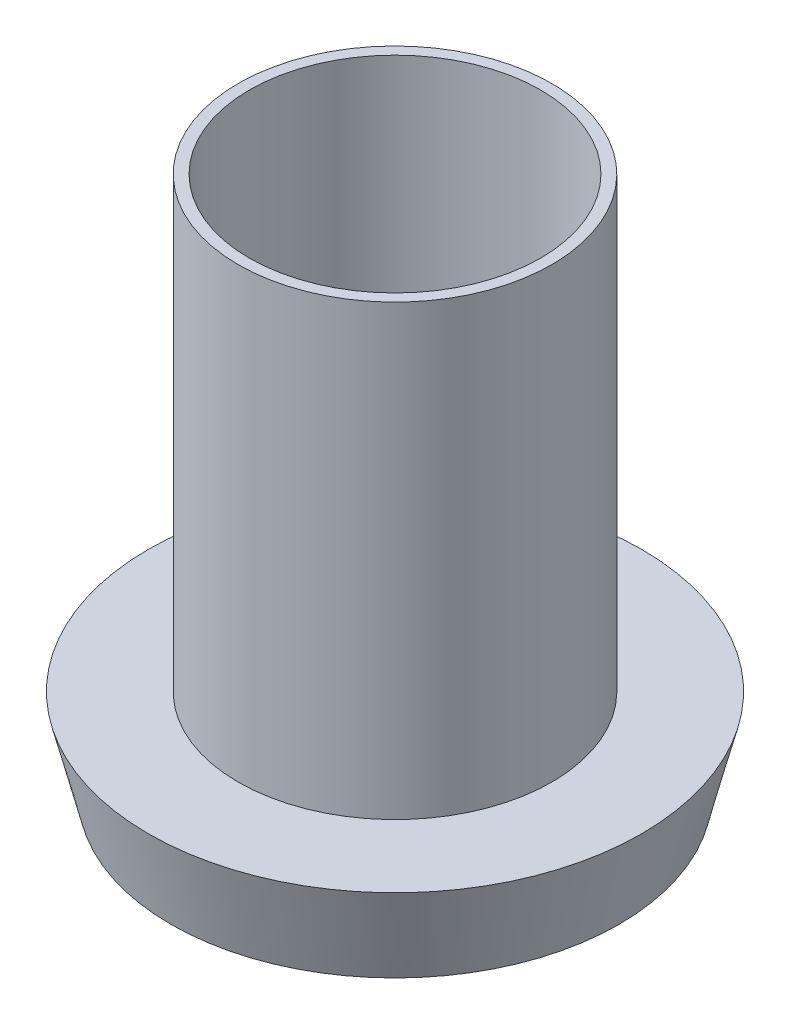
ISO-10303-21;
HEADER;
FILE_DESCRIPTION(('STEP AP214'),'2;1');
FILE_NAME('part.step','',(''),(''),'','','');
FILE_SCHEMA(('AUTOMOTIVE_DESIGN { 1 0 10303 214 1 1 1 1 }'));
ENDSEC;
DATA;
#1=APPLICATION_CONTEXT('core data for automotive mechanical design processes');
#2=APPLICATION_PROTOCOL_DEFINITION('international standard','automotive_design',2000,#1);
#3=PRODUCT_CONTEXT('',#1,'mechanical');
#4=PRODUCT('Part','Part','',(#3));
#5=PRODUCT_RELATED_PRODUCT_CATEGORY('part','',(#4));
#6=PRODUCT_DEFINITION_FORMATION('','',#4);
#7=PRODUCT_DEFINITION_CONTEXT('part definition',#1,'design');
#8=PRODUCT_DEFINITION('design','',#6,#7);
#9=PRODUCT_DEFINITION_SHAPE('','',#8);
#10=(LENGTH_UNIT() NAMED_UNIT(*) SI_UNIT(.MILLI.,.METRE.));
#11=(NAMED_UNIT(*) PLANE_ANGLE_UNIT() SI_UNIT($,.RADIAN.));
#12=(NAMED_UNIT(*) SI_UNIT($,.STERADIAN.) SOLID_ANGLE_UNIT());
#13=UNCERTAINTY_MEASURE_WITH_UNIT(LENGTH_MEASURE(1.E-05),#10,'distance_accuracy_value','');
#14=(GEOMETRIC_REPRESENTATION_CONTEXT(3) GLOBAL_UNCERTAINTY_ASSIGNED_CONTEXT((#13)) GLOBAL_UNIT_ASSIGNED_CONTEXT((#10,
#11,#12)) REPRESENTATION_CONTEXT('',''));
#15=CARTESIAN_POINT('',(0.,0.,0.));
#16=DIRECTION('',(0.,0.,1.));
#17=DIRECTION('',(1.,0.,0.));
#18=AXIS2_PLACEMENT_3D('',#15,#16,#17);
#19=CARTESIAN_POINT('',(0.,0.,0.));
#20=DIRECTION('',(0.,1.,0.));
#21=DIRECTION('',(0.,0.,1.));
#22=AXIS2_PLACEMENT_3D('',#19,#20,#21);
#23=PLANE('',#22);
#24=CARTESIAN_POINT('',(0.,0.,0.));
#25=DIRECTION('',(0.,1.,0.));
#26=DIRECTION('',(0.,0.,1.));
#27=AXIS2_PLACEMENT_3D('',#24,#25,#26);
#28=CIRCLE('',#27,0.75);
#29=CARTESIAN_POINT('',(0.,0.,0.75));
#30=VERTEX_POINT('',#29);
#31=EDGE_CURVE('E128',#30,#30,#28,.T.);
#32=ORIENTED_EDGE('',*,*,#31,.F.);
#33=EDGE_LOOP('',(#32));
#34=FACE_BOUND('',#33,.T.);
#35=CARTESIAN_POINT('',(0.,0.,0.));
#36=DIRECTION('',(0.,1.,0.));
#37=DIRECTION('',(0.,0.,1.));
#38=AXIS2_PLACEMENT_3D('',#35,#36,#37);
#39=CIRCLE('',#38,3.25);
#40=CARTESIAN_POINT('',(0.,0.,3.25));
#41=VERTEX_POINT('',#40);
#42=EDGE_CURVE('E11',#41,#41,#39,.F.);
#43=ORIENTED_EDGE('',*,*,#42,.F.);
#44=EDGE_LOOP('',(#43));
#45=FACE_BOUND('',#44,.T.);
#46=ADVANCED_FACE('F36',(#34,#45),#23,.T.);
#47=CARTESIAN_POINT('',(0.,0.,0.));
#48=DIRECTION('',(0.,1.,0.));
#49=DIRECTION('',(0.,0.,1.));
#50=AXIS2_PLACEMENT_3D('',#47,#48,#49);
#51=CIRCLE('',#50,3.5);
#52=CARTESIAN_POINT('',(0.,0.,3.5));
#53=VERTEX_POINT('',#52);
#54=EDGE_CURVE('E66',#53,#53,#51,.T.);
#55=ORIENTED_EDGE('',*,*,#54,.F.);
#56=EDGE_LOOP('',(#55));
#57=FACE_BOUND('',#56,.T.);
#58=CARTESIAN_POINT('',(0.,0.,0.));
#59=DIRECTION('',(0.,1.,0.));
#60=DIRECTION('',(0.,0.,1.));
#61=AXIS2_PLACEMENT_3D('',#58,#59,#60);
#62=CIRCLE('',#61,5.5);
#63=CARTESIAN_POINT('',(0.,0.,5.5));
#64=VERTEX_POINT('',#63);
#65=EDGE_CURVE('E44',#64,#64,#62,.T.);
#66=ORIENTED_EDGE('',*,*,#65,.T.);
#67=EDGE_LOOP('',(#66));
#68=FACE_BOUND('',#67,.T.);
#69=ADVANCED_FACE('F38',(#57,#68),#23,.T.);
#70=CARTESIAN_POINT('',(0.,-2.,0.));
#71=DIRECTION('',(0.,1.,0.));
#72=DIRECTION('',(0.,0.,1.));
#73=AXIS2_PLACEMENT_3D('',#70,#71,#72);
#74=PLANE('',#73);
#75=CARTESIAN_POINT('',(0.,-2.,0.));
#76=DIRECTION('',(0.,1.,0.));
#77=DIRECTION('',(0.,0.,1.));
#78=AXIS2_PLACEMENT_3D('',#75,#76,#77);
#79=CIRCLE('',#78,0.5);
#80=CARTESIAN_POINT('',(0.,-2.,0.5));
#81=VERTEX_POINT('',#80);
#82=EDGE_CURVE('E54',#81,#81,#79,.T.);
#83=ORIENTED_EDGE('',*,*,#82,.T.);
#84=EDGE_LOOP('',(#83));
#85=FACE_BOUND('',#84,.T.);
#86=CARTESIAN_POINT('',(0.,-2.,0.));
#87=DIRECTION('',(0.,1.,0.));
#88=DIRECTION('',(0.,0.,1.));
#89=AXIS2_PLACEMENT_3D('',#86,#87,#88);
#90=CIRCLE('',#89,5.);
#91=CARTESIAN_POINT('',(0.,-2.,5.));
#92=VERTEX_POINT('',#91);
#93=EDGE_CURVE('E48',#92,#92,#90,.T.);
#94=ORIENTED_EDGE('',*,*,#93,.F.);
#95=EDGE_LOOP('',(#94));
#96=FACE_BOUND('',#95,.T.);
#97=ADVANCED_FACE('F93',(#85,#96),#74,.F.);
#98=CARTESIAN_POINT('',(0.,-2.,0.));
#99=DIRECTION('',(0.,1.,0.));
#100=DIRECTION('',(0.,0.,1.));
#101=AXIS2_PLACEMENT_3D('',#98,#99,#100);
#102=CONICAL_SURFACE('',#101,5.,0.244978663126864);
#103=ORIENTED_EDGE('',*,*,#93,.T.);
#104=EDGE_LOOP('',(#103));
#105=FACE_BOUND('',#104,.T.);
#106=ORIENTED_EDGE('',*,*,#65,.F.);
#107=EDGE_LOOP('',(#106));
#108=FACE_BOUND('',#107,.T.);
#109=ADVANCED_FACE('F83',(#105,#108),#102,.T.);
#110=CARTESIAN_POINT('',(0.,-2.0001,0.));
#111=DIRECTION('',(0.,1.,0.));
#112=DIRECTION('',(0.,0.,1.));
#113=AXIS2_PLACEMENT_3D('',#110,#111,#112);
#114=CYLINDRICAL_SURFACE('',#113,0.5);
#115=CARTESIAN_POINT('',(0.,0.,0.));
#116=DIRECTION('',(0.,1.,0.));
#117=DIRECTION('',(0.,0.,1.));
#118=AXIS2_PLACEMENT_3D('',#115,#116,#117);
#119=CIRCLE('',#118,0.5);
#120=CARTESIAN_POINT('',(0.,0.,0.5));
#121=VERTEX_POINT('',#120);
#122=EDGE_CURVE('E134',#121,#121,#119,.F.);
#123=ORIENTED_EDGE('',*,*,#122,.F.);
#124=EDGE_LOOP('',(#123));
#125=FACE_BOUND('',#124,.T.);
#126=ORIENTED_EDGE('',*,*,#82,.F.);
#127=EDGE_LOOP('',(#126));
#128=FACE_BOUND('',#127,.T.);
#129=ADVANCED_FACE('F92',(#125,#128),#114,.F.);
#130=CARTESIAN_POINT('',(0.,10.,0.));
#131=DIRECTION('',(0.,1.,0.));
#132=DIRECTION('',(0.,0.,1.));
#133=AXIS2_PLACEMENT_3D('',#130,#131,#132);
#134=PLANE('',#133);
#135=CARTESIAN_POINT('',(0.,10.,0.));
#136=DIRECTION('',(0.,1.,0.));
#137=DIRECTION('',(0.,0.,1.));
#138=AXIS2_PLACEMENT_3D('',#135,#136,#137);
#139=CIRCLE('',#138,3.5);
#140=CARTESIAN_POINT('',(0.,10.,3.5));
#141=VERTEX_POINT('',#140);
#142=EDGE_CURVE('E62',#141,#141,#139,.T.);
#143=ORIENTED_EDGE('',*,*,#142,.T.);
#144=EDGE_LOOP('',(#143));
#145=FACE_BOUND('',#144,.T.);
#146=CARTESIAN_POINT('',(0.,10.,0.));
#147=DIRECTION('',(0.,1.,0.));
#148=DIRECTION('',(0.,0.,1.));
#149=AXIS2_PLACEMENT_3D('',#146,#147,#148);
#150=CIRCLE('',#149,3.25);
#151=CARTESIAN_POINT('',(0.,10.,3.25));
#152=VERTEX_POINT('',#151);
#153=EDGE_CURVE('E71',#152,#152,#150,.T.);
#154=ORIENTED_EDGE('',*,*,#153,.F.);
#155=EDGE_LOOP('',(#154));
#156=FACE_BOUND('',#155,.T.);
#157=ADVANCED_FACE('F148',(#145,#156),#134,.T.);
#158=CARTESIAN_POINT('',(0.,10.,0.));
#159=DIRECTION('',(0.,-1.,0.));
#160=DIRECTION('',(0.,0.,-1.));
#161=AXIS2_PLACEMENT_3D('',#158,#159,#160);
#162=CYLINDRICAL_SURFACE('',#161,3.5);
#163=ORIENTED_EDGE('',*,*,#142,.F.);
#164=EDGE_LOOP('',(#163));
#165=FACE_BOUND('',#164,.T.);
#166=ORIENTED_EDGE('',*,*,#54,.T.);
#167=EDGE_LOOP('',(#166));
#168=FACE_BOUND('',#167,.T.);
#169=ADVANCED_FACE('F150',(#165,#168),#162,.T.);
#170=CARTESIAN_POINT('',(0.,10.,0.));
#171=DIRECTION('',(0.,-1.,0.));
#172=DIRECTION('',(0.,0.,-1.));
#173=AXIS2_PLACEMENT_3D('',#170,#171,#172);
#174=CYLINDRICAL_SURFACE('',#173,3.25);
#175=ORIENTED_EDGE('',*,*,#153,.T.);
#176=EDGE_LOOP('',(#175));
#177=FACE_BOUND('',#176,.T.);
#178=ORIENTED_EDGE('',*,*,#42,.T.);
#179=EDGE_LOOP('',(#178));
#180=FACE_BOUND('',#179,.T.);
#181=ADVANCED_FACE('F146',(#177,#180),#174,.F.);
#182=CARTESIAN_POINT('',(0.,0.,0.));
#183=DIRECTION('',(0.,1.,0.));
#184=DIRECTION('',(0.,0.,1.));
#185=AXIS2_PLACEMENT_3D('',#182,#183,#184);
#186=PLANE('',#185);
#187=CARTESIAN_POINT('',(0.,0.,0.));
#188=DIRECTION('',(0.,1.,0.));
#189=DIRECTION('',(0.,0.,1.));
#190=AXIS2_PLACEMENT_3D('',#187,#188,#189);
#191=CIRCLE('',#190,0.25);
#192=CARTESIAN_POINT('',(0.,0.,0.25));
#193=VERTEX_POINT('',#192);
#194=EDGE_CURVE('E137',#193,#193,#191,.T.);
#195=ORIENTED_EDGE('',*,*,#194,.T.);
#196=EDGE_LOOP('',(#195));
#197=FACE_BOUND('',#196,.T.);
#198=ORIENTED_EDGE('',*,*,#122,.T.);
#199=EDGE_LOOP('',(#198));
#200=FACE_BOUND('',#199,.T.);
#201=ADVANCED_FACE('F162',(#197,#200),#186,.F.);
#202=CARTESIAN_POINT('',(0.,2.,0.));
#203=DIRECTION('',(0.,1.,0.));
#204=DIRECTION('',(0.,0.,1.));
#205=AXIS2_PLACEMENT_3D('',#202,#203,#204);
#206=PLANE('',#205);
#207=CARTESIAN_POINT('',(0.,2.,0.));
#208=DIRECTION('',(0.,1.,0.));
#209=DIRECTION('',(0.,0.,1.));
#210=AXIS2_PLACEMENT_3D('',#207,#208,#209);
#211=CIRCLE('',#210,0.75);
#212=CARTESIAN_POINT('',(0.,2.,0.75));
#213=VERTEX_POINT('',#212);
#214=EDGE_CURVE('E130',#213,#213,#211,.T.);
#215=ORIENTED_EDGE('',*,*,#214,.T.);
#216=EDGE_LOOP('',(#215));
#217=FACE_BOUND('',#216,.T.);
#218=CARTESIAN_POINT('',(0.,2.,0.));
#219=DIRECTION('',(0.,1.,0.));
#220=DIRECTION('',(0.,0.,1.));
#221=AXIS2_PLACEMENT_3D('',#218,#219,#220);
#222=CIRCLE('',#221,0.25);
#223=CARTESIAN_POINT('',(0.,2.,0.25));
#224=VERTEX_POINT('',#223);
#225=EDGE_CURVE('E131',#224,#224,#222,.T.);
#226=ORIENTED_EDGE('',*,*,#225,.F.);
#227=EDGE_LOOP('',(#226));
#228=FACE_BOUND('',#227,.T.);
#229=ADVANCED_FACE('F167',(#217,#228),#206,.T.);
#230=CARTESIAN_POINT('',(0.,2.,0.));
#231=DIRECTION('',(0.,-1.,0.));
#232=DIRECTION('',(0.,0.,-1.));
#233=AXIS2_PLACEMENT_3D('',#230,#231,#232);
#234=CYLINDRICAL_SURFACE('',#233,0.75);
#235=ORIENTED_EDGE('',*,*,#214,.F.);
#236=EDGE_LOOP('',(#235));
#237=FACE_BOUND('',#236,.T.);
#238=ORIENTED_EDGE('',*,*,#31,.T.);
#239=EDGE_LOOP('',(#238));
#240=FACE_BOUND('',#239,.T.);
#241=ADVANCED_FACE('F163',(#237,#240),#234,.T.);
#242=CARTESIAN_POINT('',(0.,2.,0.));
#243=DIRECTION('',(0.,-1.,0.));
#244=DIRECTION('',(0.,0.,-1.));
#245=AXIS2_PLACEMENT_3D('',#242,#243,#244);
#246=CYLINDRICAL_SURFACE('',#245,0.25);
#247=ORIENTED_EDGE('',*,*,#225,.T.);
#248=EDGE_LOOP('',(#247));
#249=FACE_BOUND('',#248,.T.);
#250=ORIENTED_EDGE('',*,*,#194,.F.);
#251=EDGE_LOOP('',(#250));
#252=FACE_BOUND('',#251,.T.);
#253=ADVANCED_FACE('F166',(#249,#252),#246,.F.);
#254=CLOSED_SHELL('',(#46,#69,#97,#109,#129,#157,#169,#181,#201,#229,#241,#253));
#255=MANIFOLD_SOLID_BREP('B2',#254);
#256=ADVANCED_BREP_SHAPE_REPRESENTATION('',(#18,#255),#14);
#257=SHAPE_DEFINITION_REPRESENTATION(#9,#256);
ENDSEC;
END-ISO-10303-21;
